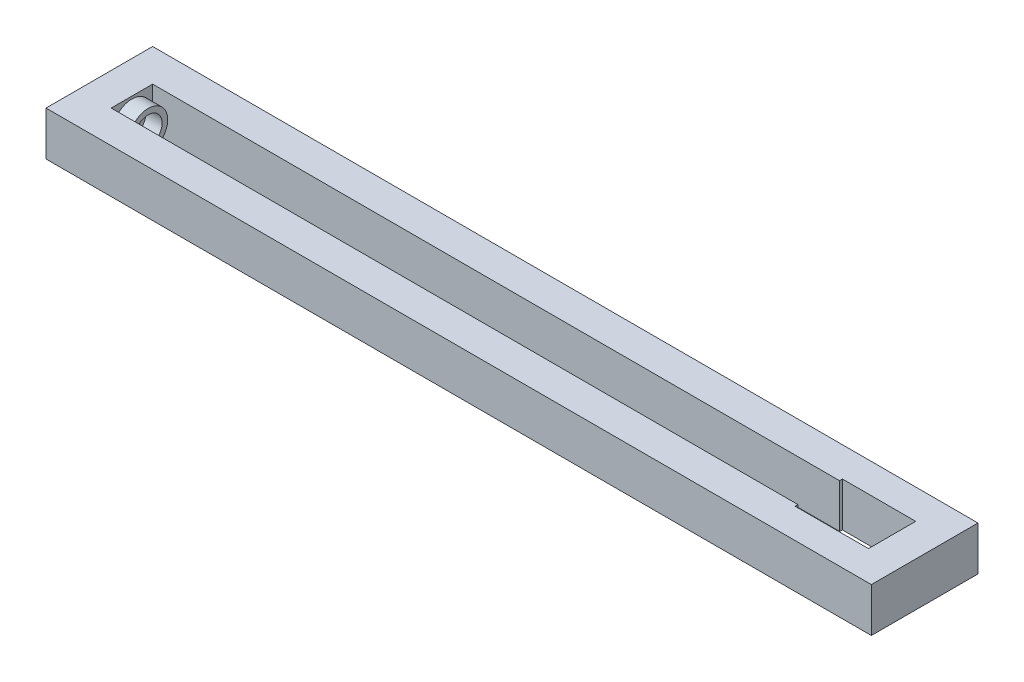
ISO-10303-21;
HEADER;
FILE_DESCRIPTION(('STEP AP214'),'2;1');
FILE_NAME('part.step','',(''),(''),'','','');
FILE_SCHEMA(('AUTOMOTIVE_DESIGN { 1 0 10303 214 1 1 1 1 }'));
ENDSEC;
DATA;
#1=APPLICATION_CONTEXT('core data for automotive mechanical design processes');
#2=APPLICATION_PROTOCOL_DEFINITION('international standard','automotive_design',2000,#1);
#3=PRODUCT_CONTEXT('',#1,'mechanical');
#4=PRODUCT('Part','Part','',(#3));
#5=PRODUCT_RELATED_PRODUCT_CATEGORY('part','',(#4));
#6=PRODUCT_DEFINITION_FORMATION('','',#4);
#7=PRODUCT_DEFINITION_CONTEXT('part definition',#1,'design');
#8=PRODUCT_DEFINITION('design','',#6,#7);
#9=PRODUCT_DEFINITION_SHAPE('','',#8);
#10=(LENGTH_UNIT() NAMED_UNIT(*) SI_UNIT(.MILLI.,.METRE.));
#11=(NAMED_UNIT(*) PLANE_ANGLE_UNIT() SI_UNIT($,.RADIAN.));
#12=(NAMED_UNIT(*) SI_UNIT($,.STERADIAN.) SOLID_ANGLE_UNIT());
#13=UNCERTAINTY_MEASURE_WITH_UNIT(LENGTH_MEASURE(1.E-05),#10,'distance_accuracy_value','');
#14=(GEOMETRIC_REPRESENTATION_CONTEXT(3) GLOBAL_UNCERTAINTY_ASSIGNED_CONTEXT((#13)) GLOBAL_UNIT_ASSIGNED_CONTEXT((#10,
#11,#12)) REPRESENTATION_CONTEXT('',''));
#15=CARTESIAN_POINT('',(0.,0.,0.));
#16=DIRECTION('',(0.,0.,1.));
#17=DIRECTION('',(1.,0.,0.));
#18=AXIS2_PLACEMENT_3D('',#15,#16,#17);
#19=CARTESIAN_POINT('',(0.,0.254,0.));
#20=DIRECTION('',(0.,-1.,0.));
#21=DIRECTION('',(0.,0.,-1.));
#22=AXIS2_PLACEMENT_3D('',#19,#20,#21);
#23=PLANE('',#22);
#24=DIRECTION('',(0.,0.,1.));
#25=VECTOR('',#24,1.);
#26=CARTESIAN_POINT('',(282.5,0.254000000000004,-21.75));
#27=LINE('',#26,#25);
#28=CARTESIAN_POINT('',(282.5,0.254000000000004,-19.1));
#29=VERTEX_POINT('',#28);
#30=CARTESIAN_POINT('',(282.5,0.254000000000004,19.1));
#31=VERTEX_POINT('',#30);
#32=EDGE_CURVE('E281',#29,#31,#27,.T.);
#33=ORIENTED_EDGE('',*,*,#32,.F.);
#34=DIRECTION('',(1.,0.,0.));
#35=VECTOR('',#34,1.);
#36=CARTESIAN_POINT('',(-349.999999999999,0.254,-19.1));
#37=LINE('',#36,#35);
#38=CARTESIAN_POINT('',(-349.999999999999,0.254,-19.1));
#39=VERTEX_POINT('',#38);
#40=EDGE_CURVE('E175',#39,#29,#37,.T.);
#41=ORIENTED_EDGE('',*,*,#40,.F.);
#42=DIRECTION('',(0.,0.,-1.));
#43=VECTOR('',#42,1.);
#44=CARTESIAN_POINT('',(-349.999999999999,0.254,19.1));
#45=LINE('',#44,#43);
#46=CARTESIAN_POINT('',(-350.,0.253999999999997,19.1));
#47=VERTEX_POINT('',#46);
#48=EDGE_CURVE('E172',#47,#39,#45,.T.);
#49=ORIENTED_EDGE('',*,*,#48,.F.);
#50=DIRECTION('',(-1.,0.,0.));
#51=VECTOR('',#50,1.);
#52=CARTESIAN_POINT('',(-349.999999999999,0.254,19.1));
#53=LINE('',#52,#51);
#54=EDGE_CURVE('E170',#31,#47,#53,.T.);
#55=ORIENTED_EDGE('',*,*,#54,.F.);
#56=EDGE_LOOP('',(#33,#41,#49,#55));
#57=FACE_BOUND('',#56,.T.);
#58=ADVANCED_FACE('F38',(#57),#23,.F.);
#59=CARTESIAN_POINT('',(350.,40.64,-19.1));
#60=DIRECTION('',(-1.,0.,0.));
#61=DIRECTION('',(0.,0.,1.));
#62=AXIS2_PLACEMENT_3D('',#59,#60,#61);
#63=PLANE('',#62);
#64=DIRECTION('',(0.,0.,-1.));
#65=VECTOR('',#64,1.);
#66=CARTESIAN_POINT('',(350.,40.64,-19.1));
#67=LINE('',#66,#65);
#68=CARTESIAN_POINT('',(350.,40.64,21.75));
#69=VERTEX_POINT('',#68);
#70=CARTESIAN_POINT('',(350.,40.64,-21.75));
#71=VERTEX_POINT('',#70);
#72=EDGE_CURVE('E61',#69,#71,#67,.T.);
#73=ORIENTED_EDGE('',*,*,#72,.T.);
#74=DIRECTION('',(0.,1.,0.));
#75=VECTOR('',#74,1.);
#76=CARTESIAN_POINT('',(350.,-80.0485528859451,-21.75));
#77=LINE('',#76,#75);
#78=CARTESIAN_POINT('',(350.,0.,-21.75));
#79=VERTEX_POINT('',#78);
#80=EDGE_CURVE('E161',#79,#71,#77,.T.);
#81=ORIENTED_EDGE('',*,*,#80,.F.);
#82=DIRECTION('',(0.,0.,1.));
#83=VECTOR('',#82,1.);
#84=CARTESIAN_POINT('',(350.,0.,-21.75));
#85=LINE('',#84,#83);
#86=CARTESIAN_POINT('',(350.,0.,21.75));
#87=VERTEX_POINT('',#86);
#88=EDGE_CURVE('E151',#79,#87,#85,.T.);
#89=ORIENTED_EDGE('',*,*,#88,.T.);
#90=DIRECTION('',(0.,1.,0.));
#91=VECTOR('',#90,1.);
#92=CARTESIAN_POINT('',(350.,-80.0485528859451,21.75));
#93=LINE('',#92,#91);
#94=EDGE_CURVE('E53',#87,#69,#93,.T.);
#95=ORIENTED_EDGE('',*,*,#94,.T.);
#96=EDGE_LOOP('',(#73,#81,#89,#95));
#97=FACE_BOUND('',#96,.T.);
#98=ADVANCED_FACE('F252',(#97),#63,.T.);
#99=CARTESIAN_POINT('',(-350.,40.64,-19.1));
#100=DIRECTION('',(0.,0.,1.));
#101=DIRECTION('',(1.,0.,0.));
#102=AXIS2_PLACEMENT_3D('',#99,#100,#101);
#103=PLANE('',#102);
#104=DIRECTION('',(0.,-1.,0.));
#105=VECTOR('',#104,1.);
#106=CARTESIAN_POINT('',(282.5,40.64,-19.1));
#107=LINE('',#106,#105);
#108=CARTESIAN_POINT('',(282.5,40.64,-19.1));
#109=VERTEX_POINT('',#108);
#110=EDGE_CURVE('E168',#109,#29,#107,.T.);
#111=ORIENTED_EDGE('',*,*,#110,.F.);
#112=DIRECTION('',(-1.,0.,0.));
#113=VECTOR('',#112,1.);
#114=CARTESIAN_POINT('',(-350.,40.64,-19.1));
#115=LINE('',#114,#113);
#116=CARTESIAN_POINT('',(-350.,40.64,-19.1));
#117=VERTEX_POINT('',#116);
#118=EDGE_CURVE('E179',#109,#117,#115,.T.);
#119=ORIENTED_EDGE('',*,*,#118,.T.);
#120=DIRECTION('',(0.,-1.,0.));
#121=VECTOR('',#120,1.);
#122=CARTESIAN_POINT('',(-350.,40.64,-19.1));
#123=LINE('',#122,#121);
#124=EDGE_CURVE('E190',#117,#39,#123,.T.);
#125=ORIENTED_EDGE('',*,*,#124,.T.);
#126=ORIENTED_EDGE('',*,*,#40,.T.);
#127=EDGE_LOOP('',(#111,#119,#125,#126));
#128=FACE_BOUND('',#127,.T.);
#129=ADVANCED_FACE('F258',(#128),#103,.T.);
#130=CARTESIAN_POINT('',(-350.,40.64,-19.1));
#131=DIRECTION('',(1.,0.,0.));
#132=DIRECTION('',(0.,0.,-1.));
#133=AXIS2_PLACEMENT_3D('',#130,#131,#132);
#134=PLANE('',#133);
#135=CARTESIAN_POINT('',(-350.,20.32,0.));
#136=DIRECTION('',(1.,0.,0.));
#137=DIRECTION('',(0.,0.,-1.));
#138=AXIS2_PLACEMENT_3D('',#135,#136,#137);
#139=CIRCLE('',#138,18.);
#140=CARTESIAN_POINT('',(-350.,20.32,-18.));
#141=VERTEX_POINT('',#140);
#142=EDGE_CURVE('E286',#141,#141,#139,.T.);
#143=ORIENTED_EDGE('',*,*,#142,.F.);
#144=EDGE_LOOP('',(#143));
#145=FACE_BOUND('',#144,.T.);
#146=DIRECTION('',(0.,-1.,0.));
#147=VECTOR('',#146,1.);
#148=CARTESIAN_POINT('',(-350.,40.64,19.1));
#149=LINE('',#148,#147);
#150=CARTESIAN_POINT('',(-350.,40.64,19.1));
#151=VERTEX_POINT('',#150);
#152=EDGE_CURVE('E187',#151,#47,#149,.T.);
#153=ORIENTED_EDGE('',*,*,#152,.T.);
#154=ORIENTED_EDGE('',*,*,#48,.T.);
#155=ORIENTED_EDGE('',*,*,#124,.F.);
#156=DIRECTION('',(0.,0.,1.));
#157=VECTOR('',#156,1.);
#158=CARTESIAN_POINT('',(-350.,40.64,-19.1));
#159=LINE('',#158,#157);
#160=EDGE_CURVE('E181',#117,#151,#159,.T.);
#161=ORIENTED_EDGE('',*,*,#160,.T.);
#162=EDGE_LOOP('',(#153,#154,#155,#161));
#163=FACE_BOUND('',#162,.T.);
#164=ADVANCED_FACE('F247',(#145,#163),#134,.T.);
#165=CARTESIAN_POINT('',(-350.,40.64,19.1));
#166=DIRECTION('',(0.,0.,-1.));
#167=DIRECTION('',(-1.,0.,0.));
#168=AXIS2_PLACEMENT_3D('',#165,#166,#167);
#169=PLANE('',#168);
#170=DIRECTION('',(0.,1.,0.));
#171=VECTOR('',#170,1.);
#172=CARTESIAN_POINT('',(282.5,40.64,19.1));
#173=LINE('',#172,#171);
#174=CARTESIAN_POINT('',(282.5,40.64,19.1));
#175=VERTEX_POINT('',#174);
#176=EDGE_CURVE('E166',#31,#175,#173,.T.);
#177=ORIENTED_EDGE('',*,*,#176,.F.);
#178=ORIENTED_EDGE('',*,*,#54,.T.);
#179=ORIENTED_EDGE('',*,*,#152,.F.);
#180=DIRECTION('',(1.,0.,0.));
#181=VECTOR('',#180,1.);
#182=CARTESIAN_POINT('',(-350.,40.64,19.1));
#183=LINE('',#182,#181);
#184=EDGE_CURVE('E184',#151,#175,#183,.T.);
#185=ORIENTED_EDGE('',*,*,#184,.T.);
#186=EDGE_LOOP('',(#177,#178,#179,#185));
#187=FACE_BOUND('',#186,.T.);
#188=ADVANCED_FACE('F240',(#187),#169,.T.);
#189=CARTESIAN_POINT('',(0.,40.64,0.));
#190=DIRECTION('',(0.,1.,0.));
#191=DIRECTION('',(0.,0.,1.));
#192=AXIS2_PLACEMENT_3D('',#189,#190,#191);
#193=PLANE('',#192);
#194=DIRECTION('',(0.,0.,1.));
#195=VECTOR('',#194,1.);
#196=CARTESIAN_POINT('',(282.5,40.64,-21.75));
#197=LINE('',#196,#195);
#198=CARTESIAN_POINT('',(282.5,40.64,21.75));
#199=VERTEX_POINT('',#198);
#200=EDGE_CURVE('E136',#175,#199,#197,.T.);
#201=ORIENTED_EDGE('',*,*,#200,.F.);
#202=ORIENTED_EDGE('',*,*,#184,.F.);
#203=ORIENTED_EDGE('',*,*,#160,.F.);
#204=ORIENTED_EDGE('',*,*,#118,.F.);
#205=CARTESIAN_POINT('',(282.5,40.64,-21.75));
#206=VERTEX_POINT('',#205);
#207=EDGE_CURVE('E157',#206,#109,#197,.T.);
#208=ORIENTED_EDGE('',*,*,#207,.F.);
#209=DIRECTION('',(-1.,0.,0.));
#210=VECTOR('',#209,1.);
#211=CARTESIAN_POINT('',(350.,40.64,-21.75));
#212=LINE('',#211,#210);
#213=EDGE_CURVE('E144',#71,#206,#212,.T.);
#214=ORIENTED_EDGE('',*,*,#213,.F.);
#215=ORIENTED_EDGE('',*,*,#72,.F.);
#216=DIRECTION('',(1.,0.,0.));
#217=VECTOR('',#216,1.);
#218=CARTESIAN_POINT('',(350.,40.64,21.75));
#219=LINE('',#218,#217);
#220=EDGE_CURVE('E155',#199,#69,#219,.T.);
#221=ORIENTED_EDGE('',*,*,#220,.F.);
#222=EDGE_LOOP('',(#201,#202,#203,#204,#208,#214,#215,#221));
#223=FACE_BOUND('',#222,.T.);
#224=DIRECTION('',(0.,0.,1.));
#225=VECTOR('',#224,1.);
#226=CARTESIAN_POINT('',(-380.,40.64,-49.1));
#227=LINE('',#226,#225);
#228=CARTESIAN_POINT('',(-380.,40.64,-49.1));
#229=VERTEX_POINT('',#228);
#230=CARTESIAN_POINT('',(-380.,40.64,49.1));
#231=VERTEX_POINT('',#230);
#232=EDGE_CURVE('E194',#229,#231,#227,.T.);
#233=ORIENTED_EDGE('',*,*,#232,.T.);
#234=DIRECTION('',(1.,0.,0.));
#235=VECTOR('',#234,1.);
#236=CARTESIAN_POINT('',(-380.,40.64,49.1));
#237=LINE('',#236,#235);
#238=CARTESIAN_POINT('',(380.,40.64,49.1));
#239=VERTEX_POINT('',#238);
#240=EDGE_CURVE('E197',#231,#239,#237,.T.);
#241=ORIENTED_EDGE('',*,*,#240,.T.);
#242=DIRECTION('',(0.,0.,-1.));
#243=VECTOR('',#242,1.);
#244=CARTESIAN_POINT('',(380.,40.64,-49.1));
#245=LINE('',#244,#243);
#246=CARTESIAN_POINT('',(380.,40.64,-49.1));
#247=VERTEX_POINT('',#246);
#248=EDGE_CURVE('E200',#239,#247,#245,.T.);
#249=ORIENTED_EDGE('',*,*,#248,.T.);
#250=DIRECTION('',(-1.,0.,0.));
#251=VECTOR('',#250,1.);
#252=CARTESIAN_POINT('',(-380.,40.64,-49.1));
#253=LINE('',#252,#251);
#254=EDGE_CURVE('E202',#247,#229,#253,.T.);
#255=ORIENTED_EDGE('',*,*,#254,.T.);
#256=EDGE_LOOP('',(#233,#241,#249,#255));
#257=FACE_BOUND('',#256,.T.);
#258=ADVANCED_FACE('F238',(#223,#257),#193,.T.);
#259=CARTESIAN_POINT('',(0.,0.,0.));
#260=DIRECTION('',(0.,1.,0.));
#261=DIRECTION('',(0.,0.,1.));
#262=AXIS2_PLACEMENT_3D('',#259,#260,#261);
#263=PLANE('',#262);
#264=DIRECTION('',(1.,0.,0.));
#265=VECTOR('',#264,1.);
#266=CARTESIAN_POINT('',(282.5,0.,-21.75));
#267=LINE('',#266,#265);
#268=CARTESIAN_POINT('',(282.5,0.,-21.75));
#269=VERTEX_POINT('',#268);
#270=EDGE_CURVE('E149',#269,#79,#267,.T.);
#271=ORIENTED_EDGE('',*,*,#270,.F.);
#272=DIRECTION('',(0.,0.,-1.));
#273=VECTOR('',#272,1.);
#274=CARTESIAN_POINT('',(282.5,0.,-21.75));
#275=LINE('',#274,#273);
#276=CARTESIAN_POINT('',(282.5,0.,21.75));
#277=VERTEX_POINT('',#276);
#278=EDGE_CURVE('E133',#277,#269,#275,.T.);
#279=ORIENTED_EDGE('',*,*,#278,.F.);
#280=DIRECTION('',(-1.,0.,0.));
#281=VECTOR('',#280,1.);
#282=CARTESIAN_POINT('',(282.5,0.,21.75));
#283=LINE('',#282,#281);
#284=EDGE_CURVE('E140',#87,#277,#283,.T.);
#285=ORIENTED_EDGE('',*,*,#284,.F.);
#286=ORIENTED_EDGE('',*,*,#88,.F.);
#287=EDGE_LOOP('',(#271,#279,#285,#286));
#288=FACE_BOUND('',#287,.T.);
#289=DIRECTION('',(0.,0.,1.));
#290=VECTOR('',#289,1.);
#291=CARTESIAN_POINT('',(-380.,0.,-49.1));
#292=LINE('',#291,#290);
#293=CARTESIAN_POINT('',(-380.,0.,-49.1));
#294=VERTEX_POINT('',#293);
#295=CARTESIAN_POINT('',(-380.,0.,49.1));
#296=VERTEX_POINT('',#295);
#297=EDGE_CURVE('E193',#294,#296,#292,.T.);
#298=ORIENTED_EDGE('',*,*,#297,.F.);
#299=DIRECTION('',(-1.,0.,0.));
#300=VECTOR('',#299,1.);
#301=CARTESIAN_POINT('',(-380.,0.,-49.1));
#302=LINE('',#301,#300);
#303=CARTESIAN_POINT('',(380.,0.,-49.1));
#304=VERTEX_POINT('',#303);
#305=EDGE_CURVE('E198',#304,#294,#302,.T.);
#306=ORIENTED_EDGE('',*,*,#305,.F.);
#307=DIRECTION('',(0.,0.,-1.));
#308=VECTOR('',#307,1.);
#309=CARTESIAN_POINT('',(380.,0.,-49.1));
#310=LINE('',#309,#308);
#311=CARTESIAN_POINT('',(380.,0.,49.1));
#312=VERTEX_POINT('',#311);
#313=EDGE_CURVE('E209',#312,#304,#310,.T.);
#314=ORIENTED_EDGE('',*,*,#313,.F.);
#315=DIRECTION('',(1.,0.,0.));
#316=VECTOR('',#315,1.);
#317=CARTESIAN_POINT('',(-380.,0.,49.1));
#318=LINE('',#317,#316);
#319=EDGE_CURVE('E207',#296,#312,#318,.T.);
#320=ORIENTED_EDGE('',*,*,#319,.F.);
#321=EDGE_LOOP('',(#298,#306,#314,#320));
#322=FACE_BOUND('',#321,.T.);
#323=ADVANCED_FACE('F146',(#288,#322),#263,.F.);
#324=CARTESIAN_POINT('',(-380.,40.64,-49.1));
#325=DIRECTION('',(1.,0.,0.));
#326=DIRECTION('',(0.,0.,-1.));
#327=AXIS2_PLACEMENT_3D('',#324,#325,#326);
#328=PLANE('',#327);
#329=ORIENTED_EDGE('',*,*,#297,.T.);
#330=DIRECTION('',(0.,-1.,0.));
#331=VECTOR('',#330,1.);
#332=CARTESIAN_POINT('',(-380.,40.64,49.1));
#333=LINE('',#332,#331);
#334=EDGE_CURVE('E46',#231,#296,#333,.T.);
#335=ORIENTED_EDGE('',*,*,#334,.F.);
#336=ORIENTED_EDGE('',*,*,#232,.F.);
#337=DIRECTION('',(0.,-1.,0.));
#338=VECTOR('',#337,1.);
#339=CARTESIAN_POINT('',(-380.,40.64,-49.1));
#340=LINE('',#339,#338);
#341=EDGE_CURVE('E204',#229,#294,#340,.T.);
#342=ORIENTED_EDGE('',*,*,#341,.T.);
#343=EDGE_LOOP('',(#329,#335,#336,#342));
#344=FACE_BOUND('',#343,.T.);
#345=ADVANCED_FACE('F40',(#344),#328,.F.);
#346=CARTESIAN_POINT('',(-380.,40.64,49.1));
#347=DIRECTION('',(0.,0.,-1.));
#348=DIRECTION('',(-1.,0.,0.));
#349=AXIS2_PLACEMENT_3D('',#346,#347,#348);
#350=PLANE('',#349);
#351=ORIENTED_EDGE('',*,*,#319,.T.);
#352=DIRECTION('',(0.,-1.,0.));
#353=VECTOR('',#352,1.);
#354=CARTESIAN_POINT('',(380.,40.64,49.1));
#355=LINE('',#354,#353);
#356=EDGE_CURVE('E217',#239,#312,#355,.T.);
#357=ORIENTED_EDGE('',*,*,#356,.F.);
#358=ORIENTED_EDGE('',*,*,#240,.F.);
#359=ORIENTED_EDGE('',*,*,#334,.T.);
#360=EDGE_LOOP('',(#351,#357,#358,#359));
#361=FACE_BOUND('',#360,.T.);
#362=ADVANCED_FACE('F222',(#361),#350,.F.);
#363=CARTESIAN_POINT('',(380.,40.64,-49.1));
#364=DIRECTION('',(-1.,0.,0.));
#365=DIRECTION('',(0.,0.,1.));
#366=AXIS2_PLACEMENT_3D('',#363,#364,#365);
#367=PLANE('',#366);
#368=ORIENTED_EDGE('',*,*,#313,.T.);
#369=DIRECTION('',(0.,-1.,0.));
#370=VECTOR('',#369,1.);
#371=CARTESIAN_POINT('',(380.,40.64,-49.1));
#372=LINE('',#371,#370);
#373=EDGE_CURVE('E214',#247,#304,#372,.T.);
#374=ORIENTED_EDGE('',*,*,#373,.F.);
#375=ORIENTED_EDGE('',*,*,#248,.F.);
#376=ORIENTED_EDGE('',*,*,#356,.T.);
#377=EDGE_LOOP('',(#368,#374,#375,#376));
#378=FACE_BOUND('',#377,.T.);
#379=ADVANCED_FACE('F232',(#378),#367,.F.);
#380=CARTESIAN_POINT('',(-380.,40.64,-49.1));
#381=DIRECTION('',(0.,0.,1.));
#382=DIRECTION('',(1.,0.,0.));
#383=AXIS2_PLACEMENT_3D('',#380,#381,#382);
#384=PLANE('',#383);
#385=ORIENTED_EDGE('',*,*,#305,.T.);
#386=ORIENTED_EDGE('',*,*,#341,.F.);
#387=ORIENTED_EDGE('',*,*,#254,.F.);
#388=ORIENTED_EDGE('',*,*,#373,.T.);
#389=EDGE_LOOP('',(#385,#386,#387,#388));
#390=FACE_BOUND('',#389,.T.);
#391=ADVANCED_FACE('F236',(#390),#384,.F.);
#392=CARTESIAN_POINT('',(282.5,-80.0485528859451,-21.75));
#393=DIRECTION('',(-1.,0.,0.));
#394=DIRECTION('',(0.,0.,1.));
#395=AXIS2_PLACEMENT_3D('',#392,#393,#394);
#396=PLANE('',#395);
#397=ORIENTED_EDGE('',*,*,#110,.T.);
#398=ORIENTED_EDGE('',*,*,#32,.T.);
#399=ORIENTED_EDGE('',*,*,#176,.T.);
#400=ORIENTED_EDGE('',*,*,#200,.T.);
#401=DIRECTION('',(0.,1.,0.));
#402=VECTOR('',#401,1.);
#403=CARTESIAN_POINT('',(282.5,-80.0485528859451,21.75));
#404=LINE('',#403,#402);
#405=EDGE_CURVE('E129',#277,#199,#404,.T.);
#406=ORIENTED_EDGE('',*,*,#405,.F.);
#407=ORIENTED_EDGE('',*,*,#278,.T.);
#408=DIRECTION('',(0.,1.,0.));
#409=VECTOR('',#408,1.);
#410=CARTESIAN_POINT('',(282.5,-80.0485528859451,-21.75));
#411=LINE('',#410,#409);
#412=EDGE_CURVE('E137',#269,#206,#411,.T.);
#413=ORIENTED_EDGE('',*,*,#412,.T.);
#414=ORIENTED_EDGE('',*,*,#207,.T.);
#415=EDGE_LOOP('',(#397,#398,#399,#400,#406,#407,#413,#414));
#416=FACE_BOUND('',#415,.T.);
#417=ADVANCED_FACE('F131',(#416),#396,.F.);
#418=CARTESIAN_POINT('',(350.,-80.0485528859451,-21.75));
#419=DIRECTION('',(0.,0.,-1.));
#420=DIRECTION('',(-1.,0.,0.));
#421=AXIS2_PLACEMENT_3D('',#418,#419,#420);
#422=PLANE('',#421);
#423=ORIENTED_EDGE('',*,*,#80,.T.);
#424=ORIENTED_EDGE('',*,*,#213,.T.);
#425=ORIENTED_EDGE('',*,*,#412,.F.);
#426=ORIENTED_EDGE('',*,*,#270,.T.);
#427=EDGE_LOOP('',(#423,#424,#425,#426));
#428=FACE_BOUND('',#427,.T.);
#429=ADVANCED_FACE('F261',(#428),#422,.F.);
#430=CARTESIAN_POINT('',(350.,-80.0485528859451,21.75));
#431=DIRECTION('',(0.,0.,1.));
#432=DIRECTION('',(1.,0.,0.));
#433=AXIS2_PLACEMENT_3D('',#430,#431,#432);
#434=PLANE('',#433);
#435=ORIENTED_EDGE('',*,*,#405,.T.);
#436=ORIENTED_EDGE('',*,*,#220,.T.);
#437=ORIENTED_EDGE('',*,*,#94,.F.);
#438=ORIENTED_EDGE('',*,*,#284,.T.);
#439=EDGE_LOOP('',(#435,#436,#437,#438));
#440=FACE_BOUND('',#439,.T.);
#441=ADVANCED_FACE('F141',(#440),#434,.F.);
#442=CARTESIAN_POINT('',(-335.,20.32,0.));
#443=DIRECTION('',(1.,0.,0.));
#444=DIRECTION('',(0.,0.,-1.));
#445=AXIS2_PLACEMENT_3D('',#442,#443,#444);
#446=PLANE('',#445);
#447=CARTESIAN_POINT('',(-335.,20.32,0.));
#448=DIRECTION('',(1.,0.,0.));
#449=DIRECTION('',(0.,0.,-1.));
#450=AXIS2_PLACEMENT_3D('',#447,#448,#449);
#451=CIRCLE('',#450,18.);
#452=CARTESIAN_POINT('',(-335.,20.32,-18.));
#453=VERTEX_POINT('',#452);
#454=EDGE_CURVE('E283',#453,#453,#451,.T.);
#455=ORIENTED_EDGE('',*,*,#454,.T.);
#456=EDGE_LOOP('',(#455));
#457=FACE_BOUND('',#456,.T.);
#458=CARTESIAN_POINT('',(-335.,20.32,0.));
#459=DIRECTION('',(1.,0.,0.));
#460=DIRECTION('',(0.,0.,-1.));
#461=AXIS2_PLACEMENT_3D('',#458,#459,#460);
#462=CIRCLE('',#461,12.8397);
#463=CARTESIAN_POINT('',(-335.,20.32,-12.8397));
#464=VERTEX_POINT('',#463);
#465=EDGE_CURVE('E290',#464,#464,#462,.T.);
#466=ORIENTED_EDGE('',*,*,#465,.F.);
#467=EDGE_LOOP('',(#466));
#468=FACE_BOUND('',#467,.T.);
#469=ADVANCED_FACE('F298',(#457,#468),#446,.T.);
#470=CARTESIAN_POINT('',(-335.,20.32,0.));
#471=DIRECTION('',(-1.,0.,0.));
#472=DIRECTION('',(0.,0.,1.));
#473=AXIS2_PLACEMENT_3D('',#470,#471,#472);
#474=CYLINDRICAL_SURFACE('',#473,18.);
#475=ORIENTED_EDGE('',*,*,#454,.F.);
#476=EDGE_LOOP('',(#475));
#477=FACE_BOUND('',#476,.T.);
#478=ORIENTED_EDGE('',*,*,#142,.T.);
#479=EDGE_LOOP('',(#478));
#480=FACE_BOUND('',#479,.T.);
#481=ADVANCED_FACE('F300',(#477,#480),#474,.T.);
#482=CARTESIAN_POINT('',(-335.,20.32,0.));
#483=DIRECTION('',(-1.,0.,0.));
#484=DIRECTION('',(0.,0.,1.));
#485=AXIS2_PLACEMENT_3D('',#482,#483,#484);
#486=CYLINDRICAL_SURFACE('',#485,12.8397);
#487=ORIENTED_EDGE('',*,*,#465,.T.);
#488=EDGE_LOOP('',(#487));
#489=FACE_BOUND('',#488,.T.);
#490=CARTESIAN_POINT('',(-350.,20.32,0.));
#491=DIRECTION('',(1.,0.,0.));
#492=DIRECTION('',(0.,0.,-1.));
#493=AXIS2_PLACEMENT_3D('',#490,#491,#492);
#494=CIRCLE('',#493,12.8397);
#495=CARTESIAN_POINT('',(-350.,20.32,-12.8397));
#496=VERTEX_POINT('',#495);
#497=EDGE_CURVE('E11',#496,#496,#494,.F.);
#498=ORIENTED_EDGE('',*,*,#497,.T.);
#499=EDGE_LOOP('',(#498));
#500=FACE_BOUND('',#499,.T.);
#501=ADVANCED_FACE('F295',(#489,#500),#486,.F.);
#502=ORIENTED_EDGE('',*,*,#497,.F.);
#503=EDGE_LOOP('',(#502));
#504=FACE_BOUND('',#503,.T.);
#505=ADVANCED_FACE('F267',(#504),#134,.T.);
#506=CLOSED_SHELL('',(#58,#98,#129,#164,#188,#258,#323,#345,#362,#379,#391,#417,#429,#441,#469,
#481,#501,#505));
#507=MANIFOLD_SOLID_BREP('B2',#506);
#508=ADVANCED_BREP_SHAPE_REPRESENTATION('',(#18,#507),#14);
#509=SHAPE_DEFINITION_REPRESENTATION(#9,#508);
ENDSEC;
END-ISO-10303-21;
